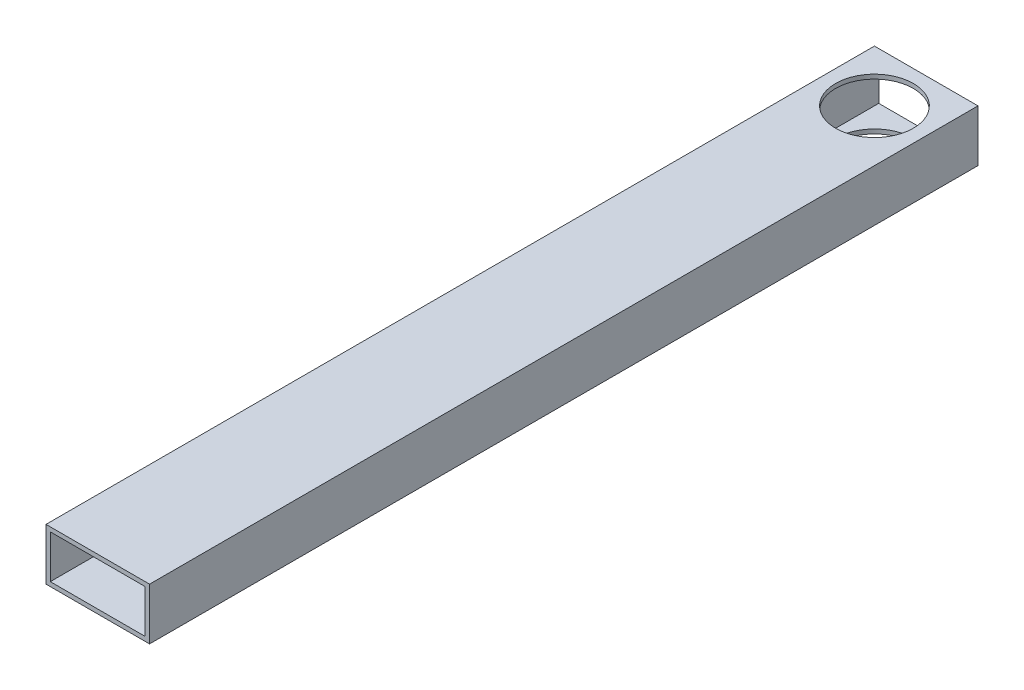
ISO-10303-21;
HEADER;
FILE_DESCRIPTION(('STEP AP214'),'2;1');
FILE_NAME('part.step','',(''),(''),'','','');
FILE_SCHEMA(('AUTOMOTIVE_DESIGN { 1 0 10303 214 1 1 1 1 }'));
ENDSEC;
DATA;
#1=APPLICATION_CONTEXT('core data for automotive mechanical design processes');
#2=APPLICATION_PROTOCOL_DEFINITION('international standard','automotive_design',2000,#1);
#3=PRODUCT_CONTEXT('',#1,'mechanical');
#4=PRODUCT('Part','Part','',(#3));
#5=PRODUCT_RELATED_PRODUCT_CATEGORY('part','',(#4));
#6=PRODUCT_DEFINITION_FORMATION('','',#4);
#7=PRODUCT_DEFINITION_CONTEXT('part definition',#1,'design');
#8=PRODUCT_DEFINITION('design','',#6,#7);
#9=PRODUCT_DEFINITION_SHAPE('','',#8);
#10=(LENGTH_UNIT() NAMED_UNIT(*) SI_UNIT(.MILLI.,.METRE.));
#11=(NAMED_UNIT(*) PLANE_ANGLE_UNIT() SI_UNIT($,.RADIAN.));
#12=(NAMED_UNIT(*) SI_UNIT($,.STERADIAN.) SOLID_ANGLE_UNIT());
#13=UNCERTAINTY_MEASURE_WITH_UNIT(LENGTH_MEASURE(1.E-05),#10,'distance_accuracy_value','');
#14=(GEOMETRIC_REPRESENTATION_CONTEXT(3) GLOBAL_UNCERTAINTY_ASSIGNED_CONTEXT((#13)) GLOBAL_UNIT_ASSIGNED_CONTEXT((#10,
#11,#12)) REPRESENTATION_CONTEXT('',''));
#15=CARTESIAN_POINT('',(0.,0.,0.));
#16=DIRECTION('',(0.,0.,1.));
#17=DIRECTION('',(1.,0.,0.));
#18=AXIS2_PLACEMENT_3D('',#15,#16,#17);
#19=CARTESIAN_POINT('',(0.,0.,304.8));
#20=DIRECTION('',(0.,0.,1.));
#21=DIRECTION('',(1.,0.,0.));
#22=AXIS2_PLACEMENT_3D('',#19,#20,#21);
#23=PLANE('',#22);
#24=DIRECTION('',(0.,-1.,0.));
#25=VECTOR('',#24,1.);
#26=CARTESIAN_POINT('',(0.,0.,304.8));
#27=LINE('',#26,#25);
#28=CARTESIAN_POINT('',(0.,19.05,304.8));
#29=VERTEX_POINT('',#28);
#30=CARTESIAN_POINT('',(0.,0.,304.8));
#31=VERTEX_POINT('',#30);
#32=EDGE_CURVE('E161',#29,#31,#27,.T.);
#33=ORIENTED_EDGE('',*,*,#32,.T.);
#34=DIRECTION('',(1.,0.,0.));
#35=VECTOR('',#34,1.);
#36=CARTESIAN_POINT('',(0.,0.,304.8));
#37=LINE('',#36,#35);
#38=CARTESIAN_POINT('',(38.1,0.,304.8));
#39=VERTEX_POINT('',#38);
#40=EDGE_CURVE('E164',#31,#39,#37,.T.);
#41=ORIENTED_EDGE('',*,*,#40,.T.);
#42=DIRECTION('',(0.,1.,0.));
#43=VECTOR('',#42,1.);
#44=CARTESIAN_POINT('',(38.1,0.,304.8));
#45=LINE('',#44,#43);
#46=CARTESIAN_POINT('',(38.1,19.05,304.8));
#47=VERTEX_POINT('',#46);
#48=EDGE_CURVE('E167',#39,#47,#45,.T.);
#49=ORIENTED_EDGE('',*,*,#48,.T.);
#50=DIRECTION('',(-1.,0.,0.));
#51=VECTOR('',#50,1.);
#52=CARTESIAN_POINT('',(0.,19.05,304.8));
#53=LINE('',#52,#51);
#54=EDGE_CURVE('E169',#47,#29,#53,.T.);
#55=ORIENTED_EDGE('',*,*,#54,.T.);
#56=EDGE_LOOP('',(#33,#41,#49,#55));
#57=FACE_BOUND('',#56,.T.);
#58=DIRECTION('',(1.,0.,0.));
#59=VECTOR('',#58,1.);
#60=CARTESIAN_POINT('',(0.,1.5875,304.8));
#61=LINE('',#60,#59);
#62=CARTESIAN_POINT('',(1.5875,1.5875,304.8));
#63=VERTEX_POINT('',#62);
#64=CARTESIAN_POINT('',(36.5125,1.5875,304.8));
#65=VERTEX_POINT('',#64);
#66=EDGE_CURVE('E131',#63,#65,#61,.T.);
#67=ORIENTED_EDGE('',*,*,#66,.F.);
#68=DIRECTION('',(0.,-1.,0.));
#69=VECTOR('',#68,1.);
#70=CARTESIAN_POINT('',(1.5875,0.,304.8));
#71=LINE('',#70,#69);
#72=CARTESIAN_POINT('',(1.5875,17.4625,304.8));
#73=VERTEX_POINT('',#72);
#74=EDGE_CURVE('E123',#73,#63,#71,.T.);
#75=ORIENTED_EDGE('',*,*,#74,.F.);
#76=DIRECTION('',(-1.,0.,0.));
#77=VECTOR('',#76,1.);
#78=CARTESIAN_POINT('',(0.,17.4625,304.8));
#79=LINE('',#78,#77);
#80=CARTESIAN_POINT('',(36.5125,17.4625,304.8));
#81=VERTEX_POINT('',#80);
#82=EDGE_CURVE('E145',#81,#73,#79,.T.);
#83=ORIENTED_EDGE('',*,*,#82,.F.);
#84=DIRECTION('',(0.,1.,0.));
#85=VECTOR('',#84,1.);
#86=CARTESIAN_POINT('',(36.5125,0.,304.8));
#87=LINE('',#86,#85);
#88=EDGE_CURVE('E143',#65,#81,#87,.T.);
#89=ORIENTED_EDGE('',*,*,#88,.F.);
#90=EDGE_LOOP('',(#67,#75,#83,#89));
#91=FACE_BOUND('',#90,.T.);
#92=ADVANCED_FACE('F57',(#57,#91),#23,.T.);
#93=CARTESIAN_POINT('',(0.,0.,0.));
#94=DIRECTION('',(0.,0.,1.));
#95=DIRECTION('',(1.,0.,0.));
#96=AXIS2_PLACEMENT_3D('',#93,#94,#95);
#97=PLANE('',#96);
#98=DIRECTION('',(0.,-1.,0.));
#99=VECTOR('',#98,1.);
#100=CARTESIAN_POINT('',(0.,0.,0.));
#101=LINE('',#100,#99);
#102=CARTESIAN_POINT('',(0.,19.05,0.));
#103=VERTEX_POINT('',#102);
#104=CARTESIAN_POINT('',(0.,0.,0.));
#105=VERTEX_POINT('',#104);
#106=EDGE_CURVE('E139',#103,#105,#101,.T.);
#107=ORIENTED_EDGE('',*,*,#106,.F.);
#108=DIRECTION('',(-1.,0.,0.));
#109=VECTOR('',#108,1.);
#110=CARTESIAN_POINT('',(0.,19.05,0.));
#111=LINE('',#110,#109);
#112=CARTESIAN_POINT('',(38.1,19.05,0.));
#113=VERTEX_POINT('',#112);
#114=EDGE_CURVE('E165',#113,#103,#111,.T.);
#115=ORIENTED_EDGE('',*,*,#114,.F.);
#116=DIRECTION('',(0.,1.,0.));
#117=VECTOR('',#116,1.);
#118=CARTESIAN_POINT('',(38.1,0.,0.));
#119=LINE('',#118,#117);
#120=CARTESIAN_POINT('',(38.1,0.,0.));
#121=VERTEX_POINT('',#120);
#122=EDGE_CURVE('E176',#121,#113,#119,.T.);
#123=ORIENTED_EDGE('',*,*,#122,.F.);
#124=DIRECTION('',(1.,0.,0.));
#125=VECTOR('',#124,1.);
#126=CARTESIAN_POINT('',(0.,0.,0.));
#127=LINE('',#126,#125);
#128=EDGE_CURVE('E174',#105,#121,#127,.T.);
#129=ORIENTED_EDGE('',*,*,#128,.F.);
#130=EDGE_LOOP('',(#107,#115,#123,#129));
#131=FACE_BOUND('',#130,.T.);
#132=DIRECTION('',(0.,-1.,0.));
#133=VECTOR('',#132,1.);
#134=CARTESIAN_POINT('',(1.5875,0.,0.));
#135=LINE('',#134,#133);
#136=CARTESIAN_POINT('',(1.5875,17.4625,0.));
#137=VERTEX_POINT('',#136);
#138=CARTESIAN_POINT('',(1.5875,1.5875,0.));
#139=VERTEX_POINT('',#138);
#140=EDGE_CURVE('E81',#137,#139,#135,.T.);
#141=ORIENTED_EDGE('',*,*,#140,.T.);
#142=DIRECTION('',(1.,0.,0.));
#143=VECTOR('',#142,1.);
#144=CARTESIAN_POINT('',(0.,1.5875,0.));
#145=LINE('',#144,#143);
#146=CARTESIAN_POINT('',(36.5125,1.5875,0.));
#147=VERTEX_POINT('',#146);
#148=EDGE_CURVE('E138',#139,#147,#145,.T.);
#149=ORIENTED_EDGE('',*,*,#148,.T.);
#150=DIRECTION('',(0.,1.,0.));
#151=VECTOR('',#150,1.);
#152=CARTESIAN_POINT('',(36.5125,0.,0.));
#153=LINE('',#152,#151);
#154=CARTESIAN_POINT('',(36.5125,17.4625,0.));
#155=VERTEX_POINT('',#154);
#156=EDGE_CURVE('E153',#147,#155,#153,.T.);
#157=ORIENTED_EDGE('',*,*,#156,.T.);
#158=DIRECTION('',(-1.,0.,0.));
#159=VECTOR('',#158,1.);
#160=CARTESIAN_POINT('',(0.,17.4625,0.));
#161=LINE('',#160,#159);
#162=EDGE_CURVE('E132',#155,#137,#161,.T.);
#163=ORIENTED_EDGE('',*,*,#162,.T.);
#164=EDGE_LOOP('',(#141,#149,#157,#163));
#165=FACE_BOUND('',#164,.T.);
#166=ADVANCED_FACE('F195',(#131,#165),#97,.F.);
#167=CARTESIAN_POINT('',(0.,0.,304.8));
#168=DIRECTION('',(1.,0.,0.));
#169=DIRECTION('',(0.,0.,-1.));
#170=AXIS2_PLACEMENT_3D('',#167,#168,#169);
#171=PLANE('',#170);
#172=ORIENTED_EDGE('',*,*,#106,.T.);
#173=DIRECTION('',(0.,0.,-1.));
#174=VECTOR('',#173,1.);
#175=CARTESIAN_POINT('',(0.,0.,304.8));
#176=LINE('',#175,#174);
#177=EDGE_CURVE('E12',#31,#105,#176,.T.);
#178=ORIENTED_EDGE('',*,*,#177,.F.);
#179=ORIENTED_EDGE('',*,*,#32,.F.);
#180=DIRECTION('',(0.,0.,-1.));
#181=VECTOR('',#180,1.);
#182=CARTESIAN_POINT('',(0.,19.05,304.8));
#183=LINE('',#182,#181);
#184=EDGE_CURVE('E171',#29,#103,#183,.T.);
#185=ORIENTED_EDGE('',*,*,#184,.T.);
#186=EDGE_LOOP('',(#172,#178,#179,#185));
#187=FACE_BOUND('',#186,.T.);
#188=ADVANCED_FACE('F59',(#187),#171,.F.);
#189=CARTESIAN_POINT('',(0.,0.,304.8));
#190=DIRECTION('',(0.,1.,0.));
#191=DIRECTION('',(0.,0.,1.));
#192=AXIS2_PLACEMENT_3D('',#189,#190,#191);
#193=PLANE('',#192);
#194=CARTESIAN_POINT('',(19.05,0.,19.05));
#195=DIRECTION('',(0.,-1.,0.));
#196=DIRECTION('',(0.,0.,-1.));
#197=AXIS2_PLACEMENT_3D('',#194,#195,#196);
#198=CIRCLE('',#197,14.2875);
#199=CARTESIAN_POINT('',(19.05,0.,4.76250000000001));
#200=VERTEX_POINT('',#199);
#201=EDGE_CURVE('E232',#200,#200,#198,.T.);
#202=ORIENTED_EDGE('',*,*,#201,.F.);
#203=EDGE_LOOP('',(#202));
#204=FACE_BOUND('',#203,.T.);
#205=ORIENTED_EDGE('',*,*,#128,.T.);
#206=DIRECTION('',(0.,0.,-1.));
#207=VECTOR('',#206,1.);
#208=CARTESIAN_POINT('',(38.1,0.,304.8));
#209=LINE('',#208,#207);
#210=EDGE_CURVE('E66',#39,#121,#209,.T.);
#211=ORIENTED_EDGE('',*,*,#210,.F.);
#212=ORIENTED_EDGE('',*,*,#40,.F.);
#213=ORIENTED_EDGE('',*,*,#177,.T.);
#214=EDGE_LOOP('',(#205,#211,#212,#213));
#215=FACE_BOUND('',#214,.T.);
#216=ADVANCED_FACE('F205',(#204,#215),#193,.F.);
#217=CARTESIAN_POINT('',(38.1,0.,304.8));
#218=DIRECTION('',(-1.,0.,0.));
#219=DIRECTION('',(0.,0.,1.));
#220=AXIS2_PLACEMENT_3D('',#217,#218,#219);
#221=PLANE('',#220);
#222=ORIENTED_EDGE('',*,*,#122,.T.);
#223=DIRECTION('',(0.,0.,-1.));
#224=VECTOR('',#223,1.);
#225=CARTESIAN_POINT('',(38.1,19.05,304.8));
#226=LINE('',#225,#224);
#227=EDGE_CURVE('E181',#47,#113,#226,.T.);
#228=ORIENTED_EDGE('',*,*,#227,.F.);
#229=ORIENTED_EDGE('',*,*,#48,.F.);
#230=ORIENTED_EDGE('',*,*,#210,.T.);
#231=EDGE_LOOP('',(#222,#228,#229,#230));
#232=FACE_BOUND('',#231,.T.);
#233=ADVANCED_FACE('F189',(#232),#221,.F.);
#234=CARTESIAN_POINT('',(0.,19.05,304.8));
#235=DIRECTION('',(0.,-1.,0.));
#236=DIRECTION('',(0.,0.,-1.));
#237=AXIS2_PLACEMENT_3D('',#234,#235,#236);
#238=PLANE('',#237);
#239=CARTESIAN_POINT('',(19.05,19.05,19.05));
#240=DIRECTION('',(0.,-1.,0.));
#241=DIRECTION('',(0.,0.,-1.));
#242=AXIS2_PLACEMENT_3D('',#239,#240,#241);
#243=CIRCLE('',#242,14.2875);
#244=CARTESIAN_POINT('',(19.05,19.05,4.76250000000001));
#245=VERTEX_POINT('',#244);
#246=EDGE_CURVE('E230',#245,#245,#243,.T.);
#247=ORIENTED_EDGE('',*,*,#246,.T.);
#248=EDGE_LOOP('',(#247));
#249=FACE_BOUND('',#248,.T.);
#250=ORIENTED_EDGE('',*,*,#114,.T.);
#251=ORIENTED_EDGE('',*,*,#184,.F.);
#252=ORIENTED_EDGE('',*,*,#54,.F.);
#253=ORIENTED_EDGE('',*,*,#227,.T.);
#254=EDGE_LOOP('',(#250,#251,#252,#253));
#255=FACE_BOUND('',#254,.T.);
#256=ADVANCED_FACE('F199',(#249,#255),#238,.F.);
#257=CARTESIAN_POINT('',(1.5875,0.,304.8));
#258=DIRECTION('',(1.,0.,0.));
#259=DIRECTION('',(0.,0.,-1.));
#260=AXIS2_PLACEMENT_3D('',#257,#258,#259);
#261=PLANE('',#260);
#262=ORIENTED_EDGE('',*,*,#140,.F.);
#263=DIRECTION('',(0.,0.,-1.));
#264=VECTOR('',#263,1.);
#265=CARTESIAN_POINT('',(1.5875,17.4625,304.8));
#266=LINE('',#265,#264);
#267=EDGE_CURVE('E127',#73,#137,#266,.T.);
#268=ORIENTED_EDGE('',*,*,#267,.F.);
#269=ORIENTED_EDGE('',*,*,#74,.T.);
#270=DIRECTION('',(0.,0.,-1.));
#271=VECTOR('',#270,1.);
#272=CARTESIAN_POINT('',(1.5875,1.5875,304.8));
#273=LINE('',#272,#271);
#274=EDGE_CURVE('E126',#63,#139,#273,.T.);
#275=ORIENTED_EDGE('',*,*,#274,.T.);
#276=EDGE_LOOP('',(#262,#268,#269,#275));
#277=FACE_BOUND('',#276,.T.);
#278=ADVANCED_FACE('F125',(#277),#261,.T.);
#279=CARTESIAN_POINT('',(0.,1.5875,304.8));
#280=DIRECTION('',(0.,1.,0.));
#281=DIRECTION('',(0.,0.,1.));
#282=AXIS2_PLACEMENT_3D('',#279,#280,#281);
#283=PLANE('',#282);
#284=CARTESIAN_POINT('',(19.05,1.5875,19.05));
#285=DIRECTION('',(0.,1.,0.));
#286=DIRECTION('',(0.,0.,1.));
#287=AXIS2_PLACEMENT_3D('',#284,#285,#286);
#288=CIRCLE('',#287,14.2875);
#289=CARTESIAN_POINT('',(19.05,1.5875,4.76250000000001));
#290=VERTEX_POINT('',#289);
#291=EDGE_CURVE('E151',#290,#290,#288,.T.);
#292=ORIENTED_EDGE('',*,*,#291,.F.);
#293=EDGE_LOOP('',(#292));
#294=FACE_BOUND('',#293,.T.);
#295=ORIENTED_EDGE('',*,*,#148,.F.);
#296=ORIENTED_EDGE('',*,*,#274,.F.);
#297=ORIENTED_EDGE('',*,*,#66,.T.);
#298=DIRECTION('',(0.,0.,-1.));
#299=VECTOR('',#298,1.);
#300=CARTESIAN_POINT('',(36.5125,1.5875,304.8));
#301=LINE('',#300,#299);
#302=EDGE_CURVE('E140',#65,#147,#301,.T.);
#303=ORIENTED_EDGE('',*,*,#302,.T.);
#304=EDGE_LOOP('',(#295,#296,#297,#303));
#305=FACE_BOUND('',#304,.T.);
#306=ADVANCED_FACE('F135',(#294,#305),#283,.T.);
#307=CARTESIAN_POINT('',(36.5125,0.,304.8));
#308=DIRECTION('',(-1.,0.,0.));
#309=DIRECTION('',(0.,0.,1.));
#310=AXIS2_PLACEMENT_3D('',#307,#308,#309);
#311=PLANE('',#310);
#312=ORIENTED_EDGE('',*,*,#156,.F.);
#313=ORIENTED_EDGE('',*,*,#302,.F.);
#314=ORIENTED_EDGE('',*,*,#88,.T.);
#315=DIRECTION('',(0.,0.,-1.));
#316=VECTOR('',#315,1.);
#317=CARTESIAN_POINT('',(36.5125,17.4625,304.8));
#318=LINE('',#317,#316);
#319=EDGE_CURVE('E73',#81,#155,#318,.T.);
#320=ORIENTED_EDGE('',*,*,#319,.T.);
#321=EDGE_LOOP('',(#312,#313,#314,#320));
#322=FACE_BOUND('',#321,.T.);
#323=ADVANCED_FACE('F244',(#322),#311,.T.);
#324=CARTESIAN_POINT('',(0.,17.4625,304.8));
#325=DIRECTION('',(0.,-1.,0.));
#326=DIRECTION('',(0.,0.,-1.));
#327=AXIS2_PLACEMENT_3D('',#324,#325,#326);
#328=PLANE('',#327);
#329=CARTESIAN_POINT('',(19.05,17.4625,19.05));
#330=DIRECTION('',(0.,-1.,0.));
#331=DIRECTION('',(0.,0.,-1.));
#332=AXIS2_PLACEMENT_3D('',#329,#330,#331);
#333=CIRCLE('',#332,14.2875);
#334=CARTESIAN_POINT('',(19.05,17.4625,4.76250000000001));
#335=VERTEX_POINT('',#334);
#336=EDGE_CURVE('E61',#335,#335,#333,.T.);
#337=ORIENTED_EDGE('',*,*,#336,.F.);
#338=EDGE_LOOP('',(#337));
#339=FACE_BOUND('',#338,.T.);
#340=ORIENTED_EDGE('',*,*,#162,.F.);
#341=ORIENTED_EDGE('',*,*,#319,.F.);
#342=ORIENTED_EDGE('',*,*,#82,.T.);
#343=ORIENTED_EDGE('',*,*,#267,.T.);
#344=EDGE_LOOP('',(#340,#341,#342,#343));
#345=FACE_BOUND('',#344,.T.);
#346=ADVANCED_FACE('F248',(#339,#345),#328,.T.);
#347=CARTESIAN_POINT('',(19.05,19.05,19.05));
#348=DIRECTION('',(0.,-1.,0.));
#349=DIRECTION('',(0.,0.,-1.));
#350=AXIS2_PLACEMENT_3D('',#347,#348,#349);
#351=CYLINDRICAL_SURFACE('',#350,14.2875);
#352=CARTESIAN_POINT('',(19.05,17.4625,4.76250000000001));
#353=CARTESIAN_POINT('',(19.05,17.4790364583333,4.76250000000001));
#354=CARTESIAN_POINT('',(19.05,17.4955729166667,4.76250000000001));
#355=CARTESIAN_POINT('',(19.05,17.5286458333333,4.76250000000001));
#356=CARTESIAN_POINT('',(19.05,17.5451822916667,4.76250000000001));
#357=CARTESIAN_POINT('',(19.05,17.5782552083333,4.76250000000001));
#358=CARTESIAN_POINT('',(19.05,17.5947916666667,4.76250000000001));
#359=CARTESIAN_POINT('',(19.05,17.6278645833333,4.76250000000001));
#360=CARTESIAN_POINT('',(19.05,17.6444010416667,4.76250000000001));
#361=CARTESIAN_POINT('',(19.05,17.6774739583333,4.76250000000001));
#362=CARTESIAN_POINT('',(19.05,17.6940104166667,4.76250000000001));
#363=CARTESIAN_POINT('',(19.05,17.7270833333333,4.76250000000001));
#364=CARTESIAN_POINT('',(19.05,17.7436197916667,4.76250000000001));
#365=CARTESIAN_POINT('',(19.05,17.7766927083333,4.76250000000001));
#366=CARTESIAN_POINT('',(19.05,17.7932291666667,4.76250000000001));
#367=CARTESIAN_POINT('',(19.05,17.8263020833333,4.76250000000001));
#368=CARTESIAN_POINT('',(19.05,17.8428385416667,4.76250000000001));
#369=CARTESIAN_POINT('',(19.05,17.8759114583333,4.76250000000001));
#370=CARTESIAN_POINT('',(19.05,17.8924479166667,4.76250000000001));
#371=CARTESIAN_POINT('',(19.05,17.9255208333333,4.76250000000001));
#372=CARTESIAN_POINT('',(19.05,17.9420572916667,4.76250000000001));
#373=CARTESIAN_POINT('',(19.05,17.9751302083333,4.76250000000001));
#374=CARTESIAN_POINT('',(19.05,17.9916666666667,4.76250000000001));
#375=CARTESIAN_POINT('',(19.05,18.0247395833333,4.76250000000001));
#376=CARTESIAN_POINT('',(19.05,18.0412760416667,4.76250000000001));
#377=CARTESIAN_POINT('',(19.05,18.0743489583333,4.76250000000001));
#378=CARTESIAN_POINT('',(19.05,18.0908854166667,4.76250000000001));
#379=CARTESIAN_POINT('',(19.05,18.1239583333333,4.76250000000001));
#380=CARTESIAN_POINT('',(19.05,18.1404947916667,4.76250000000001));
#381=CARTESIAN_POINT('',(19.05,18.1735677083333,4.76250000000001));
#382=CARTESIAN_POINT('',(19.05,18.1901041666667,4.76250000000001));
#383=CARTESIAN_POINT('',(19.05,18.2231770833333,4.76250000000001));
#384=CARTESIAN_POINT('',(19.05,18.2397135416667,4.76250000000001));
#385=CARTESIAN_POINT('',(19.05,18.2727864583333,4.76250000000001));
#386=CARTESIAN_POINT('',(19.05,18.2893229166667,4.76250000000001));
#387=CARTESIAN_POINT('',(19.05,18.3223958333333,4.76250000000001));
#388=CARTESIAN_POINT('',(19.05,18.3389322916667,4.76250000000001));
#389=CARTESIAN_POINT('',(19.05,18.3720052083333,4.76250000000001));
#390=CARTESIAN_POINT('',(19.05,18.3885416666667,4.76250000000001));
#391=CARTESIAN_POINT('',(19.05,18.4216145833333,4.76250000000001));
#392=CARTESIAN_POINT('',(19.05,18.4381510416667,4.76250000000001));
#393=CARTESIAN_POINT('',(19.05,18.4712239583333,4.76250000000001));
#394=CARTESIAN_POINT('',(19.05,18.4877604166667,4.76250000000001));
#395=CARTESIAN_POINT('',(19.05,18.5208333333333,4.76250000000001));
#396=CARTESIAN_POINT('',(19.05,18.5373697916667,4.76250000000001));
#397=CARTESIAN_POINT('',(19.05,18.5704427083333,4.76250000000001));
#398=CARTESIAN_POINT('',(19.05,18.5869791666667,4.76250000000001));
#399=CARTESIAN_POINT('',(19.05,18.6200520833333,4.76250000000001));
#400=CARTESIAN_POINT('',(19.05,18.6365885416667,4.76250000000001));
#401=CARTESIAN_POINT('',(19.05,18.6696614583333,4.76250000000001));
#402=CARTESIAN_POINT('',(19.05,18.6861979166667,4.76250000000001));
#403=CARTESIAN_POINT('',(19.05,18.7192708333333,4.76250000000001));
#404=CARTESIAN_POINT('',(19.05,18.7358072916667,4.76250000000001));
#405=CARTESIAN_POINT('',(19.05,18.7688802083333,4.76250000000001));
#406=CARTESIAN_POINT('',(19.05,18.7854166666667,4.76250000000001));
#407=CARTESIAN_POINT('',(19.05,18.8184895833333,4.76250000000001));
#408=CARTESIAN_POINT('',(19.05,18.8350260416667,4.76250000000001));
#409=CARTESIAN_POINT('',(19.05,18.8680989583333,4.76250000000001));
#410=CARTESIAN_POINT('',(19.05,18.8846354166667,4.76250000000001));
#411=CARTESIAN_POINT('',(19.05,18.9177083333333,4.76250000000001));
#412=CARTESIAN_POINT('',(19.05,18.9342447916667,4.76250000000001));
#413=CARTESIAN_POINT('',(19.05,18.9673177083333,4.76250000000001));
#414=CARTESIAN_POINT('',(19.05,18.9838541666667,4.76250000000001));
#415=CARTESIAN_POINT('',(19.05,19.0169270833333,4.76250000000001));
#416=CARTESIAN_POINT('',(19.05,19.0334635416667,4.76250000000001));
#417=CARTESIAN_POINT('',(19.05,19.05,4.76250000000001));
#418=B_SPLINE_CURVE_WITH_KNOTS('',3,(#352,#353,#354,#355,#356,#357,#358,#359,#360,#361,#362,
#363,#364,#365,#366,#367,#368,#369,#370,#371,#372,#373,#374,#375,#376,#377,#378,#379,#380,#381,
#382,#383,#384,#385,#386,#387,#388,#389,#390,#391,#392,#393,#394,#395,#396,#397,#398,#399,#400,
#401,#402,#403,#404,#405,#406,#407,#408,#409,#410,#411,#412,#413,#414,#415,#416,#417),
.UNSPECIFIED.,.F.,.F.,(4,2,2,2,2,2,2,2,2,2,2,2,2,2,2,2,2,2,2,2,2,2,2,2,2,2,2,2,2,2,2,2,4),(0.,
0.0496093750000023,0.0992187500000012,0.148828125,0.198437500000002,0.248046875000001,
0.29765625,0.347265625000003,0.396875000000001,0.446484375,0.496093750000003,0.545703125000002,
0.5953125,0.644921875000003,0.694531250000002,0.744140625,0.793749999999999,0.843359375000002,
0.892968750000001,0.942578124999999,0.992187500000002,1.041796875,1.09140625,1.141015625,
1.190625,1.240234375,1.28984375,1.339453125,1.3890625,1.438671875,1.48828125,1.537890625,
1.5875),.UNSPECIFIED.);
#419=EDGE_CURVE('BSEAM254',#335,#245,#418,.T.);
#420=ORIENTED_EDGE('',*,*,#336,.T.);
#421=ORIENTED_EDGE('',*,*,#246,.F.);
#422=ORIENTED_EDGE('',*,*,#419,.T.);
#423=ORIENTED_EDGE('',*,*,#419,.F.);
#424=EDGE_LOOP('',(#420,#422,#421,#423));
#425=FACE_BOUND('',#424,.T.);
#426=ADVANCED_FACE('F254',(#425),#351,.F.);
#427=CARTESIAN_POINT('',(19.05,1.5875,4.76250000000001));
#428=CARTESIAN_POINT('',(19.05,1.57096354166667,4.76250000000001));
#429=CARTESIAN_POINT('',(19.05,1.55442708333333,4.76250000000001));
#430=CARTESIAN_POINT('',(19.05,1.52135416666667,4.76250000000001));
#431=CARTESIAN_POINT('',(19.05,1.50481770833333,4.76250000000001));
#432=CARTESIAN_POINT('',(19.05,1.47174479166666,4.76250000000001));
#433=CARTESIAN_POINT('',(19.05,1.45520833333333,4.76250000000001));
#434=CARTESIAN_POINT('',(19.05,1.42213541666667,4.76250000000001));
#435=CARTESIAN_POINT('',(19.05,1.40559895833333,4.76250000000001));
#436=CARTESIAN_POINT('',(19.05,1.37252604166667,4.76250000000001));
#437=CARTESIAN_POINT('',(19.05,1.35598958333333,4.76250000000001));
#438=CARTESIAN_POINT('',(19.05,1.32291666666666,4.76250000000001));
#439=CARTESIAN_POINT('',(19.05,1.30638020833333,4.76250000000001));
#440=CARTESIAN_POINT('',(19.05,1.27330729166667,4.76250000000001));
#441=CARTESIAN_POINT('',(19.05,1.25677083333333,4.76250000000001));
#442=CARTESIAN_POINT('',(19.05,1.22369791666667,4.76250000000001));
#443=CARTESIAN_POINT('',(19.05,1.20716145833333,4.76250000000001));
#444=CARTESIAN_POINT('',(19.05,1.17408854166667,4.76250000000001));
#445=CARTESIAN_POINT('',(19.05,1.15755208333333,4.76250000000001));
#446=CARTESIAN_POINT('',(19.05,1.12447916666667,4.76250000000001));
#447=CARTESIAN_POINT('',(19.05,1.10794270833333,4.76250000000001));
#448=CARTESIAN_POINT('',(19.05,1.07486979166667,4.76250000000001));
#449=CARTESIAN_POINT('',(19.05,1.05833333333333,4.76250000000001));
#450=CARTESIAN_POINT('',(19.05,1.02526041666667,4.76250000000001));
#451=CARTESIAN_POINT('',(19.05,1.00872395833333,4.76250000000001));
#452=CARTESIAN_POINT('',(19.05,0.975651041666665,4.76250000000001));
#453=CARTESIAN_POINT('',(19.05,0.959114583333332,4.76250000000001));
#454=CARTESIAN_POINT('',(19.05,0.926041666666666,4.76250000000001));
#455=CARTESIAN_POINT('',(19.05,0.909505208333333,4.76250000000001));
#456=CARTESIAN_POINT('',(19.05,0.876432291666666,4.76250000000001));
#457=CARTESIAN_POINT('',(19.05,0.859895833333332,4.76250000000001));
#458=CARTESIAN_POINT('',(19.05,0.826822916666665,4.76250000000001));
#459=CARTESIAN_POINT('',(19.05,0.810286458333332,4.76250000000001));
#460=CARTESIAN_POINT('',(19.05,0.777213541666666,4.76250000000001));
#461=CARTESIAN_POINT('',(19.05,0.760677083333333,4.76250000000001));
#462=CARTESIAN_POINT('',(19.05,0.727604166666666,4.76250000000001));
#463=CARTESIAN_POINT('',(19.05,0.711067708333332,4.76250000000001));
#464=CARTESIAN_POINT('',(19.05,0.677994791666665,4.76250000000001));
#465=CARTESIAN_POINT('',(19.05,0.661458333333332,4.76250000000001));
#466=CARTESIAN_POINT('',(19.05,0.628385416666666,4.76250000000001));
#467=CARTESIAN_POINT('',(19.05,0.611848958333333,4.76250000000001));
#468=CARTESIAN_POINT('',(19.05,0.578776041666666,4.76250000000001));
#469=CARTESIAN_POINT('',(19.05,0.562239583333332,4.76250000000001));
#470=CARTESIAN_POINT('',(19.05,0.529166666666665,4.76250000000001));
#471=CARTESIAN_POINT('',(19.05,0.512630208333332,4.76250000000001));
#472=CARTESIAN_POINT('',(19.05,0.479557291666666,4.76250000000001));
#473=CARTESIAN_POINT('',(19.05,0.463020833333333,4.76250000000001));
#474=CARTESIAN_POINT('',(19.05,0.429947916666666,4.76250000000001));
#475=CARTESIAN_POINT('',(19.05,0.413411458333332,4.76250000000001));
#476=CARTESIAN_POINT('',(19.05,0.380338541666665,4.76250000000001));
#477=CARTESIAN_POINT('',(19.05,0.363802083333332,4.76250000000001));
#478=CARTESIAN_POINT('',(19.05,0.330729166666666,4.76250000000001));
#479=CARTESIAN_POINT('',(19.05,0.314192708333333,4.76250000000001));
#480=CARTESIAN_POINT('',(19.05,0.281119791666667,4.76250000000001));
#481=CARTESIAN_POINT('',(19.05,0.264583333333334,4.76250000000001));
#482=CARTESIAN_POINT('',(19.05,0.231510416666667,4.76250000000001));
#483=CARTESIAN_POINT('',(19.05,0.214973958333333,4.76250000000001));
#484=CARTESIAN_POINT('',(19.05,0.181901041666666,4.76250000000001));
#485=CARTESIAN_POINT('',(19.05,0.165364583333333,4.76250000000001));
#486=CARTESIAN_POINT('',(19.05,0.132291666666667,4.76250000000001));
#487=CARTESIAN_POINT('',(19.05,0.115755208333334,4.76250000000001));
#488=CARTESIAN_POINT('',(19.05,0.0826822916666671,4.76250000000001));
#489=CARTESIAN_POINT('',(19.05,0.066145833333333,4.76250000000001));
#490=CARTESIAN_POINT('',(19.05,0.0330729166666659,4.76250000000001));
#491=CARTESIAN_POINT('',(19.05,0.016536458333333,4.76250000000001));
#492=CARTESIAN_POINT('',(19.05,0.,4.76250000000001));
#493=B_SPLINE_CURVE_WITH_KNOTS('',3,(#427,#428,#429,#430,#431,#432,#433,#434,#435,#436,#437,
#438,#439,#440,#441,#442,#443,#444,#445,#446,#447,#448,#449,#450,#451,#452,#453,#454,#455,#456,
#457,#458,#459,#460,#461,#462,#463,#464,#465,#466,#467,#468,#469,#470,#471,#472,#473,#474,#475,
#476,#477,#478,#479,#480,#481,#482,#483,#484,#485,#486,#487,#488,#489,#490,#491,#492),
.UNSPECIFIED.,.F.,.F.,(4,2,2,2,2,2,2,2,2,2,2,2,2,2,2,2,2,2,2,2,2,2,2,2,2,2,2,2,2,2,2,2,4),(0.,
0.0496093749999989,0.0992187500000012,0.148828125,0.198437499999999,0.248046875000001,
0.29765625,0.347265624999999,0.396874999999998,0.446484375,0.496093749999999,0.545703124999998,
0.5953125,0.644921874999999,0.694531249999998,0.744140625,0.793749999999999,0.843359374999998,
0.892968750000001,0.942578124999999,0.992187499999998,1.041796875,1.09140625,1.141015625,
1.190625,1.240234375,1.28984375,1.339453125,1.3890625,1.438671875,1.48828125,1.537890625,
1.5875),.UNSPECIFIED.);
#494=EDGE_CURVE('BSEAM240',#290,#200,#493,.T.);
#495=ORIENTED_EDGE('',*,*,#291,.T.);
#496=ORIENTED_EDGE('',*,*,#201,.T.);
#497=ORIENTED_EDGE('',*,*,#494,.T.);
#498=ORIENTED_EDGE('',*,*,#494,.F.);
#499=EDGE_LOOP('',(#495,#497,#496,#498));
#500=FACE_BOUND('',#499,.T.);
#501=ADVANCED_FACE('F240',(#500),#351,.F.);
#502=CLOSED_SHELL('',(#92,#166,#188,#216,#233,#256,#278,#306,#323,#346,#426,#501));
#503=MANIFOLD_SOLID_BREP('B2',#502);
#504=ADVANCED_BREP_SHAPE_REPRESENTATION('',(#18,#503),#14);
#505=SHAPE_DEFINITION_REPRESENTATION(#9,#504);
ENDSEC;
END-ISO-10303-21;
